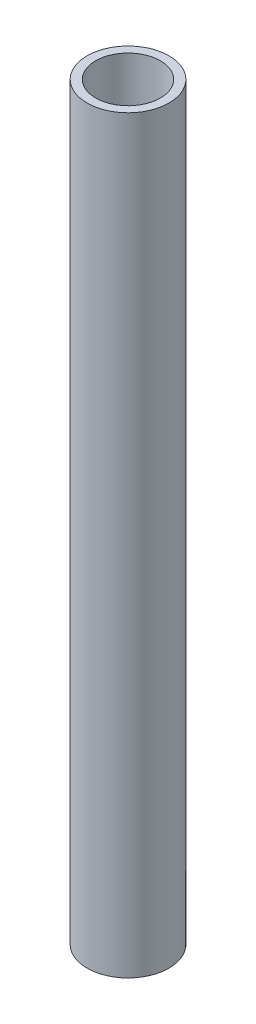
ISO-10303-21;
HEADER;
FILE_DESCRIPTION(('STEP AP214'),'2;1');
FILE_NAME('part.step','',(''),(''),'','','');
FILE_SCHEMA(('AUTOMOTIVE_DESIGN { 1 0 10303 214 1 1 1 1 }'));
ENDSEC;
DATA;
#1=APPLICATION_CONTEXT('core data for automotive mechanical design processes');
#2=APPLICATION_PROTOCOL_DEFINITION('international standard','automotive_design',2000,#1);
#3=PRODUCT_CONTEXT('',#1,'mechanical');
#4=PRODUCT('Part','Part','',(#3));
#5=PRODUCT_RELATED_PRODUCT_CATEGORY('part','',(#4));
#6=PRODUCT_DEFINITION_FORMATION('','',#4);
#7=PRODUCT_DEFINITION_CONTEXT('part definition',#1,'design');
#8=PRODUCT_DEFINITION('design','',#6,#7);
#9=PRODUCT_DEFINITION_SHAPE('','',#8);
#10=(LENGTH_UNIT() NAMED_UNIT(*) SI_UNIT(.MILLI.,.METRE.));
#11=(NAMED_UNIT(*) PLANE_ANGLE_UNIT() SI_UNIT($,.RADIAN.));
#12=(NAMED_UNIT(*) SI_UNIT($,.STERADIAN.) SOLID_ANGLE_UNIT());
#13=UNCERTAINTY_MEASURE_WITH_UNIT(LENGTH_MEASURE(1.E-05),#10,'distance_accuracy_value','');
#14=(GEOMETRIC_REPRESENTATION_CONTEXT(3) GLOBAL_UNCERTAINTY_ASSIGNED_CONTEXT((#13)) GLOBAL_UNIT_ASSIGNED_CONTEXT((#10,
#11,#12)) REPRESENTATION_CONTEXT('',''));
#15=CARTESIAN_POINT('',(0.,0.,0.));
#16=DIRECTION('',(0.,0.,1.));
#17=DIRECTION('',(1.,0.,0.));
#18=AXIS2_PLACEMENT_3D('',#15,#16,#17);
#19=CARTESIAN_POINT('',(0.,304.8,0.));
#20=DIRECTION('',(0.,1.,0.));
#21=DIRECTION('',(0.,0.,1.));
#22=AXIS2_PLACEMENT_3D('',#19,#20,#21);
#23=PLANE('',#22);
#24=CARTESIAN_POINT('',(0.,304.8,0.));
#25=DIRECTION('',(0.,1.,0.));
#26=DIRECTION('',(0.,0.,1.));
#27=AXIS2_PLACEMENT_3D('',#24,#25,#26);
#28=CIRCLE('',#27,16.65);
#29=CARTESIAN_POINT('',(0.,304.8,-16.65));
#30=VERTEX_POINT('',#29);
#31=EDGE_CURVE('E10',#30,#30,#28,.T.);
#32=ORIENTED_EDGE('',*,*,#31,.T.);
#33=EDGE_LOOP('',(#32));
#34=FACE_BOUND('',#33,.T.);
#35=CARTESIAN_POINT('',(0.,304.8,0.));
#36=DIRECTION('',(0.,1.,0.));
#37=DIRECTION('',(0.,0.,1.));
#38=AXIS2_PLACEMENT_3D('',#35,#36,#37);
#39=CIRCLE('',#38,13.15);
#40=CARTESIAN_POINT('',(0.,304.8,-13.15));
#41=VERTEX_POINT('',#40);
#42=EDGE_CURVE('E41',#41,#41,#39,.T.);
#43=ORIENTED_EDGE('',*,*,#42,.F.);
#44=EDGE_LOOP('',(#43));
#45=FACE_BOUND('',#44,.T.);
#46=ADVANCED_FACE('F30',(#34,#45),#23,.T.);
#47=CARTESIAN_POINT('',(0.,0.,0.));
#48=DIRECTION('',(0.,1.,0.));
#49=DIRECTION('',(0.,0.,1.));
#50=AXIS2_PLACEMENT_3D('',#47,#48,#49);
#51=PLANE('',#50);
#52=CARTESIAN_POINT('',(0.,0.,0.));
#53=DIRECTION('',(0.,1.,0.));
#54=DIRECTION('',(0.,0.,1.));
#55=AXIS2_PLACEMENT_3D('',#52,#53,#54);
#56=CIRCLE('',#55,16.65);
#57=CARTESIAN_POINT('',(0.,0.,-16.65));
#58=VERTEX_POINT('',#57);
#59=EDGE_CURVE('E34',#58,#58,#56,.T.);
#60=ORIENTED_EDGE('',*,*,#59,.F.);
#61=EDGE_LOOP('',(#60));
#62=FACE_BOUND('',#61,.T.);
#63=CARTESIAN_POINT('',(0.,0.,0.));
#64=DIRECTION('',(0.,1.,0.));
#65=DIRECTION('',(0.,0.,1.));
#66=AXIS2_PLACEMENT_3D('',#63,#64,#65);
#67=CIRCLE('',#66,13.15);
#68=CARTESIAN_POINT('',(0.,0.,-13.15));
#69=VERTEX_POINT('',#68);
#70=EDGE_CURVE('E43',#69,#69,#67,.T.);
#71=ORIENTED_EDGE('',*,*,#70,.T.);
#72=EDGE_LOOP('',(#71));
#73=FACE_BOUND('',#72,.T.);
#74=ADVANCED_FACE('F53',(#62,#73),#51,.F.);
#75=CARTESIAN_POINT('',(0.,304.8,0.));
#76=DIRECTION('',(0.,-1.,0.));
#77=DIRECTION('',(0.,0.,-1.));
#78=AXIS2_PLACEMENT_3D('',#75,#76,#77);
#79=CYLINDRICAL_SURFACE('',#78,16.65);
#80=CARTESIAN_POINT('',(0.,304.8,-16.65));
#81=CARTESIAN_POINT('',(0.,301.625,-16.65));
#82=CARTESIAN_POINT('',(0.,298.45,-16.65));
#83=CARTESIAN_POINT('',(0.,292.1,-16.65));
#84=CARTESIAN_POINT('',(0.,288.925,-16.65));
#85=CARTESIAN_POINT('',(0.,282.575,-16.65));
#86=CARTESIAN_POINT('',(0.,279.4,-16.65));
#87=CARTESIAN_POINT('',(0.,273.05,-16.65));
#88=CARTESIAN_POINT('',(0.,269.875,-16.65));
#89=CARTESIAN_POINT('',(0.,263.525,-16.65));
#90=CARTESIAN_POINT('',(0.,260.35,-16.65));
#91=CARTESIAN_POINT('',(0.,254.,-16.65));
#92=CARTESIAN_POINT('',(0.,250.825,-16.65));
#93=CARTESIAN_POINT('',(0.,244.475,-16.65));
#94=CARTESIAN_POINT('',(0.,241.3,-16.65));
#95=CARTESIAN_POINT('',(0.,234.95,-16.65));
#96=CARTESIAN_POINT('',(0.,231.775,-16.65));
#97=CARTESIAN_POINT('',(0.,225.425,-16.65));
#98=CARTESIAN_POINT('',(0.,222.25,-16.65));
#99=CARTESIAN_POINT('',(0.,215.9,-16.65));
#100=CARTESIAN_POINT('',(0.,212.725,-16.65));
#101=CARTESIAN_POINT('',(0.,206.375,-16.65));
#102=CARTESIAN_POINT('',(0.,203.2,-16.65));
#103=CARTESIAN_POINT('',(0.,196.85,-16.65));
#104=CARTESIAN_POINT('',(0.,193.675,-16.65));
#105=CARTESIAN_POINT('',(0.,187.325,-16.65));
#106=CARTESIAN_POINT('',(0.,184.15,-16.65));
#107=CARTESIAN_POINT('',(0.,177.8,-16.65));
#108=CARTESIAN_POINT('',(0.,174.625,-16.65));
#109=CARTESIAN_POINT('',(0.,168.275,-16.65));
#110=CARTESIAN_POINT('',(0.,165.1,-16.65));
#111=CARTESIAN_POINT('',(0.,158.75,-16.65));
#112=CARTESIAN_POINT('',(0.,155.575,-16.65));
#113=CARTESIAN_POINT('',(0.,149.225,-16.65));
#114=CARTESIAN_POINT('',(0.,146.05,-16.65));
#115=CARTESIAN_POINT('',(0.,139.7,-16.65));
#116=CARTESIAN_POINT('',(0.,136.525,-16.65));
#117=CARTESIAN_POINT('',(0.,130.175,-16.65));
#118=CARTESIAN_POINT('',(0.,127.,-16.65));
#119=CARTESIAN_POINT('',(0.,120.65,-16.65));
#120=CARTESIAN_POINT('',(0.,117.475,-16.65));
#121=CARTESIAN_POINT('',(0.,111.125,-16.65));
#122=CARTESIAN_POINT('',(0.,107.95,-16.65));
#123=CARTESIAN_POINT('',(0.,101.6,-16.65));
#124=CARTESIAN_POINT('',(0.,98.425,-16.65));
#125=CARTESIAN_POINT('',(0.,92.075,-16.65));
#126=CARTESIAN_POINT('',(0.,88.9,-16.65));
#127=CARTESIAN_POINT('',(0.,82.55,-16.65));
#128=CARTESIAN_POINT('',(0.,79.375,-16.65));
#129=CARTESIAN_POINT('',(0.,73.025,-16.65));
#130=CARTESIAN_POINT('',(0.,69.85,-16.65));
#131=CARTESIAN_POINT('',(0.,63.5,-16.65));
#132=CARTESIAN_POINT('',(0.,60.325,-16.65));
#133=CARTESIAN_POINT('',(0.,53.975,-16.65));
#134=CARTESIAN_POINT('',(0.,50.8,-16.65));
#135=CARTESIAN_POINT('',(0.,44.45,-16.65));
#136=CARTESIAN_POINT('',(0.,41.275,-16.65));
#137=CARTESIAN_POINT('',(0.,34.925,-16.65));
#138=CARTESIAN_POINT('',(0.,31.75,-16.65));
#139=CARTESIAN_POINT('',(0.,25.4,-16.65));
#140=CARTESIAN_POINT('',(0.,22.225,-16.65));
#141=CARTESIAN_POINT('',(0.,15.875,-16.65));
#142=CARTESIAN_POINT('',(0.,12.7,-16.65));
#143=CARTESIAN_POINT('',(0.,6.35,-16.65));
#144=CARTESIAN_POINT('',(0.,3.175,-16.65));
#145=CARTESIAN_POINT('',(0.,0.,-16.65));
#146=B_SPLINE_CURVE_WITH_KNOTS('',3,(#80,#81,#82,#83,#84,#85,#86,#87,#88,#89,#90,#91,#92,#93,
#94,#95,#96,#97,#98,#99,#100,#101,#102,#103,#104,#105,#106,#107,#108,#109,#110,#111,#112,#113,
#114,#115,#116,#117,#118,#119,#120,#121,#122,#123,#124,#125,#126,#127,#128,#129,#130,#131,#132,
#133,#134,#135,#136,#137,#138,#139,#140,#141,#142,#143,#144,#145),.UNSPECIFIED.,.F.,.F.,(4,2,2,
2,2,2,2,2,2,2,2,2,2,2,2,2,2,2,2,2,2,2,2,2,2,2,2,2,2,2,2,2,4),(0.,9.52499999999995,19.05,28.575,
38.1,47.625,57.15,66.675,76.2,85.725,95.2499999999999,104.775,114.3,123.825,133.35,142.875,
152.4,161.925,171.45,180.975,190.5,200.025,209.55,219.075,228.6,238.125,247.65,257.175,266.7,
276.225,285.75,295.275,304.8),.UNSPECIFIED.);
#147=EDGE_CURVE('BSEAM32',#30,#58,#146,.T.);
#148=ORIENTED_EDGE('',*,*,#31,.F.);
#149=ORIENTED_EDGE('',*,*,#59,.T.);
#150=ORIENTED_EDGE('',*,*,#147,.T.);
#151=ORIENTED_EDGE('',*,*,#147,.F.);
#152=EDGE_LOOP('',(#148,#150,#149,#151));
#153=FACE_BOUND('',#152,.T.);
#154=ADVANCED_FACE('F32',(#153),#79,.T.);
#155=CARTESIAN_POINT('',(0.,304.8,0.));
#156=DIRECTION('',(0.,-1.,0.));
#157=DIRECTION('',(0.,0.,-1.));
#158=AXIS2_PLACEMENT_3D('',#155,#156,#157);
#159=CYLINDRICAL_SURFACE('',#158,13.15);
#160=CARTESIAN_POINT('',(0.,304.8,-13.15));
#161=CARTESIAN_POINT('',(0.,301.625,-13.15));
#162=CARTESIAN_POINT('',(0.,298.45,-13.15));
#163=CARTESIAN_POINT('',(0.,292.1,-13.15));
#164=CARTESIAN_POINT('',(0.,288.925,-13.15));
#165=CARTESIAN_POINT('',(0.,282.575,-13.15));
#166=CARTESIAN_POINT('',(0.,279.4,-13.15));
#167=CARTESIAN_POINT('',(0.,273.05,-13.15));
#168=CARTESIAN_POINT('',(0.,269.875,-13.15));
#169=CARTESIAN_POINT('',(0.,263.525,-13.15));
#170=CARTESIAN_POINT('',(0.,260.35,-13.15));
#171=CARTESIAN_POINT('',(0.,254.,-13.15));
#172=CARTESIAN_POINT('',(0.,250.825,-13.15));
#173=CARTESIAN_POINT('',(0.,244.475,-13.15));
#174=CARTESIAN_POINT('',(0.,241.3,-13.15));
#175=CARTESIAN_POINT('',(0.,234.95,-13.15));
#176=CARTESIAN_POINT('',(0.,231.775,-13.15));
#177=CARTESIAN_POINT('',(0.,225.425,-13.15));
#178=CARTESIAN_POINT('',(0.,222.25,-13.15));
#179=CARTESIAN_POINT('',(0.,215.9,-13.15));
#180=CARTESIAN_POINT('',(0.,212.725,-13.15));
#181=CARTESIAN_POINT('',(0.,206.375,-13.15));
#182=CARTESIAN_POINT('',(0.,203.2,-13.15));
#183=CARTESIAN_POINT('',(0.,196.85,-13.15));
#184=CARTESIAN_POINT('',(0.,193.675,-13.15));
#185=CARTESIAN_POINT('',(0.,187.325,-13.15));
#186=CARTESIAN_POINT('',(0.,184.15,-13.15));
#187=CARTESIAN_POINT('',(0.,177.8,-13.15));
#188=CARTESIAN_POINT('',(0.,174.625,-13.15));
#189=CARTESIAN_POINT('',(0.,168.275,-13.15));
#190=CARTESIAN_POINT('',(0.,165.1,-13.15));
#191=CARTESIAN_POINT('',(0.,158.75,-13.15));
#192=CARTESIAN_POINT('',(0.,155.575,-13.15));
#193=CARTESIAN_POINT('',(0.,149.225,-13.15));
#194=CARTESIAN_POINT('',(0.,146.05,-13.15));
#195=CARTESIAN_POINT('',(0.,139.7,-13.15));
#196=CARTESIAN_POINT('',(0.,136.525,-13.15));
#197=CARTESIAN_POINT('',(0.,130.175,-13.15));
#198=CARTESIAN_POINT('',(0.,127.,-13.15));
#199=CARTESIAN_POINT('',(0.,120.65,-13.15));
#200=CARTESIAN_POINT('',(0.,117.475,-13.15));
#201=CARTESIAN_POINT('',(0.,111.125,-13.15));
#202=CARTESIAN_POINT('',(0.,107.95,-13.15));
#203=CARTESIAN_POINT('',(0.,101.6,-13.15));
#204=CARTESIAN_POINT('',(0.,98.425,-13.15));
#205=CARTESIAN_POINT('',(0.,92.075,-13.15));
#206=CARTESIAN_POINT('',(0.,88.9,-13.15));
#207=CARTESIAN_POINT('',(0.,82.55,-13.15));
#208=CARTESIAN_POINT('',(0.,79.375,-13.15));
#209=CARTESIAN_POINT('',(0.,73.025,-13.15));
#210=CARTESIAN_POINT('',(0.,69.85,-13.15));
#211=CARTESIAN_POINT('',(0.,63.5,-13.15));
#212=CARTESIAN_POINT('',(0.,60.325,-13.15));
#213=CARTESIAN_POINT('',(0.,53.975,-13.15));
#214=CARTESIAN_POINT('',(0.,50.8,-13.15));
#215=CARTESIAN_POINT('',(0.,44.45,-13.15));
#216=CARTESIAN_POINT('',(0.,41.275,-13.15));
#217=CARTESIAN_POINT('',(0.,34.925,-13.15));
#218=CARTESIAN_POINT('',(0.,31.75,-13.15));
#219=CARTESIAN_POINT('',(0.,25.4,-13.15));
#220=CARTESIAN_POINT('',(0.,22.225,-13.15));
#221=CARTESIAN_POINT('',(0.,15.875,-13.15));
#222=CARTESIAN_POINT('',(0.,12.7,-13.15));
#223=CARTESIAN_POINT('',(0.,6.35,-13.15));
#224=CARTESIAN_POINT('',(0.,3.175,-13.15));
#225=CARTESIAN_POINT('',(0.,0.,-13.15));
#226=B_SPLINE_CURVE_WITH_KNOTS('',3,(#160,#161,#162,#163,#164,#165,#166,#167,#168,#169,#170,
#171,#172,#173,#174,#175,#176,#177,#178,#179,#180,#181,#182,#183,#184,#185,#186,#187,#188,#189,
#190,#191,#192,#193,#194,#195,#196,#197,#198,#199,#200,#201,#202,#203,#204,#205,#206,#207,#208,
#209,#210,#211,#212,#213,#214,#215,#216,#217,#218,#219,#220,#221,#222,#223,#224,#225),
.UNSPECIFIED.,.F.,.F.,(4,2,2,2,2,2,2,2,2,2,2,2,2,2,2,2,2,2,2,2,2,2,2,2,2,2,2,2,2,2,2,2,4),(0.,
9.52499999999995,19.05,28.575,38.1,47.625,57.15,66.675,76.2,85.725,95.2499999999999,104.775,
114.3,123.825,133.35,142.875,152.4,161.925,171.45,180.975,190.5,200.025,209.55,219.075,228.6,
238.125,247.65,257.175,266.7,276.225,285.75,295.275,304.8),.UNSPECIFIED.);
#227=EDGE_CURVE('BSEAM49',#41,#69,#226,.T.);
#228=ORIENTED_EDGE('',*,*,#42,.T.);
#229=ORIENTED_EDGE('',*,*,#70,.F.);
#230=ORIENTED_EDGE('',*,*,#227,.T.);
#231=ORIENTED_EDGE('',*,*,#227,.F.);
#232=EDGE_LOOP('',(#228,#230,#229,#231));
#233=FACE_BOUND('',#232,.T.);
#234=ADVANCED_FACE('F49',(#233),#159,.F.);
#235=CLOSED_SHELL('',(#46,#74,#154,#234));
#236=MANIFOLD_SOLID_BREP('B2',#235);
#237=ADVANCED_BREP_SHAPE_REPRESENTATION('',(#18,#236),#14);
#238=SHAPE_DEFINITION_REPRESENTATION(#9,#237);
ENDSEC;
END-ISO-10303-21;
